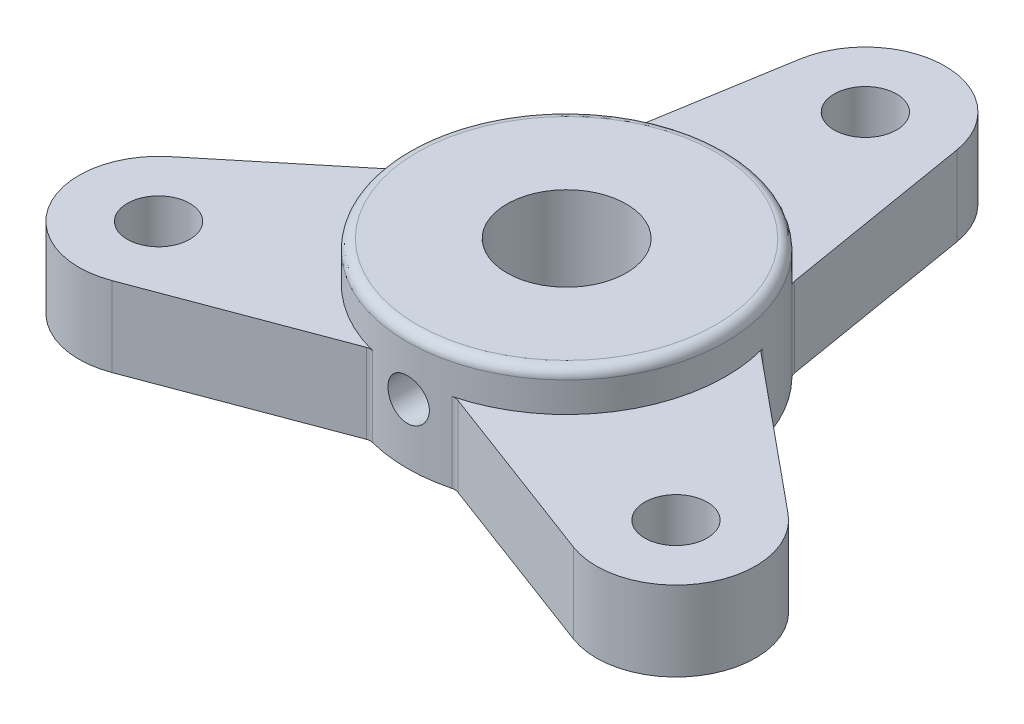
ISO-10303-21;
HEADER;
FILE_DESCRIPTION(('STEP AP214'),'2;1');
FILE_NAME('part.step','',(''),(''),'','','');
FILE_SCHEMA(('AUTOMOTIVE_DESIGN { 1 0 10303 214 1 1 1 1 }'));
ENDSEC;
DATA;
#1=APPLICATION_CONTEXT('core data for automotive mechanical design processes');
#2=APPLICATION_PROTOCOL_DEFINITION('international standard','automotive_design',2000,#1);
#3=PRODUCT_CONTEXT('',#1,'mechanical');
#4=PRODUCT('Part','Part','',(#3));
#5=PRODUCT_RELATED_PRODUCT_CATEGORY('part','',(#4));
#6=PRODUCT_DEFINITION_FORMATION('','',#4);
#7=PRODUCT_DEFINITION_CONTEXT('part definition',#1,'design');
#8=PRODUCT_DEFINITION('design','',#6,#7);
#9=PRODUCT_DEFINITION_SHAPE('','',#8);
#10=(LENGTH_UNIT() NAMED_UNIT(*) SI_UNIT(.MILLI.,.METRE.));
#11=(NAMED_UNIT(*) PLANE_ANGLE_UNIT() SI_UNIT($,.RADIAN.));
#12=(NAMED_UNIT(*) SI_UNIT($,.STERADIAN.) SOLID_ANGLE_UNIT());
#13=UNCERTAINTY_MEASURE_WITH_UNIT(LENGTH_MEASURE(1.E-05),#10,'distance_accuracy_value','');
#14=(GEOMETRIC_REPRESENTATION_CONTEXT(3) GLOBAL_UNCERTAINTY_ASSIGNED_CONTEXT((#13)) GLOBAL_UNIT_ASSIGNED_CONTEXT((#10,
#11,#12)) REPRESENTATION_CONTEXT('',''));
#15=CARTESIAN_POINT('',(0.,0.,0.));
#16=DIRECTION('',(0.,0.,1.));
#17=DIRECTION('',(1.,0.,0.));
#18=AXIS2_PLACEMENT_3D('',#15,#16,#17);
#19=CARTESIAN_POINT('',(0.,0.,0.));
#20=DIRECTION('',(0.,1.,0.));
#21=DIRECTION('',(0.,0.,1.));
#22=AXIS2_PLACEMENT_3D('',#19,#20,#21);
#23=PLANE('',#22);
#24=CARTESIAN_POINT('',(20.6222299276169,0.,11.90625));
#25=DIRECTION('',(0.,1.,0.));
#26=DIRECTION('',(0.,0.,1.));
#27=AXIS2_PLACEMENT_3D('',#24,#25,#26);
#28=CIRCLE('',#27,2.4892);
#29=CARTESIAN_POINT('',(20.6222299276169,0.,14.39545));
#30=VERTEX_POINT('',#29);
#31=EDGE_CURVE('E396',#30,#30,#28,.T.);
#32=ORIENTED_EDGE('',*,*,#31,.F.);
#33=EDGE_LOOP('',(#32));
#34=FACE_BOUND('',#33,.T.);
#35=CARTESIAN_POINT('',(0.,0.,0.));
#36=DIRECTION('',(0.,1.,0.));
#37=DIRECTION('',(0.,0.,1.));
#38=AXIS2_PLACEMENT_3D('',#35,#36,#37);
#39=CIRCLE('',#38,12.7);
#40=CARTESIAN_POINT('',(3.17099498333641,0.,12.2977555194294));
#41=VERTEX_POINT('',#40);
#42=CARTESIAN_POINT('',(12.2356661810243,0.,-3.40271554887235));
#43=VERTEX_POINT('',#42);
#44=EDGE_CURVE('E376',#41,#43,#39,.T.);
#45=ORIENTED_EDGE('',*,*,#44,.F.);
#46=CARTESIAN_POINT('',(3.36918216979494,0.,13.0663652393937));
#47=DIRECTION('',(0.,1.,0.));
#48=DIRECTION('',(0.,0.,1.));
#49=AXIS2_PLACEMENT_3D('',#46,#47,#48);
#50=CIRCLE('',#49,0.79375);
#51=CARTESIAN_POINT('',(3.64786519836011,0.,12.3231460038449));
#52=VERTEX_POINT('',#51);
#53=EDGE_CURVE('E356',#41,#52,#50,.F.);
#54=ORIENTED_EDGE('',*,*,#53,.T.);
#55=DIRECTION('',(-0.936339194392192,0.,-0.351096728900998));
#56=VECTOR('',#55,1.);
#57=CARTESIAN_POINT('',(-3.6015119976426,0.,9.60486545409366));
#58=LINE('',#57,#56);
#59=CARTESIAN_POINT('',(18.3927656990956,0.,17.8520038843904));
#60=VERTEX_POINT('',#59);
#61=EDGE_CURVE('E252',#60,#52,#58,.T.);
#62=ORIENTED_EDGE('',*,*,#61,.F.);
#63=CARTESIAN_POINT('',(20.6222299276169,0.,11.90625));
#64=DIRECTION('',(0.,1.,0.));
#65=DIRECTION('',(0.,0.,1.));
#66=AXIS2_PLACEMENT_3D('',#63,#64,#65);
#67=CIRCLE('',#66,6.35000000000001);
#68=CARTESIAN_POINT('',(24.6566717218884,0.,7.00260039907662));
#69=VERTEX_POINT('',#68);
#70=EDGE_CURVE('E256',#69,#60,#67,.F.);
#71=ORIENTED_EDGE('',*,*,#70,.F.);
#72=DIRECTION('',(-0.772228283609979,0.,-0.635345164452195));
#73=VECTOR('',#72,1.);
#74=CARTESIAN_POINT('',(6.51730148435537,0.,-7.92143360903976));
#75=LINE('',#74,#73);
#76=CARTESIAN_POINT('',(12.4960900930544,0.,-3.00242907056145));
#77=VERTEX_POINT('',#76);
#78=EDGE_CURVE('E259',#69,#77,#75,.T.);
#79=ORIENTED_EDGE('',*,*,#78,.T.);
#80=CARTESIAN_POINT('',(13.0003953173383,0.,-3.61538527067687));
#81=DIRECTION('',(0.,1.,0.));
#82=DIRECTION('',(0.,0.,1.));
#83=AXIS2_PLACEMENT_3D('',#80,#81,#82);
#84=CIRCLE('',#83,0.79375);
#85=EDGE_CURVE('E331',#77,#43,#84,.F.);
#86=ORIENTED_EDGE('',*,*,#85,.T.);
#87=EDGE_LOOP('',(#45,#54,#62,#71,#79,#86));
#88=FACE_BOUND('',#87,.T.);
#89=ADVANCED_FACE('F38',(#34,#88),#23,.T.);
#90=CARTESIAN_POINT('',(0.,0.,-23.8125));
#91=DIRECTION('',(0.,1.,0.));
#92=DIRECTION('',(0.,0.,1.));
#93=AXIS2_PLACEMENT_3D('',#90,#91,#92);
#94=CIRCLE('',#93,2.4892);
#95=CARTESIAN_POINT('',(0.,0.,-21.3233));
#96=VERTEX_POINT('',#95);
#97=EDGE_CURVE('E404',#96,#96,#94,.T.);
#98=ORIENTED_EDGE('',*,*,#97,.F.);
#99=EDGE_LOOP('',(#98));
#100=FACE_BOUND('',#99,.T.);
#101=CARTESIAN_POINT('',(9.06467119768792,0.,-8.89503997055702));
#102=VERTEX_POINT('',#101);
#103=CARTESIAN_POINT('',(-9.06467119768792,0.,-8.89503997055702));
#104=VERTEX_POINT('',#103);
#105=EDGE_CURVE('E287',#102,#104,#39,.T.);
#106=ORIENTED_EDGE('',*,*,#105,.F.);
#107=CARTESIAN_POINT('',(9.63121314754341,0.,-9.45097996871683));
#108=DIRECTION('',(0.,1.,0.));
#109=DIRECTION('',(0.,0.,1.));
#110=AXIS2_PLACEMENT_3D('',#107,#108,#109);
#111=CIRCLE('',#110,0.79375);
#112=CARTESIAN_POINT('',(8.84822489469432,0.,-9.32071693328345));
#113=VERTEX_POINT('',#112);
#114=EDGE_CURVE('E350',#102,#113,#111,.F.);
#115=ORIENTED_EDGE('',*,*,#114,.T.);
#116=DIRECTION('',(0.164110910782213,0.,0.986441893353193));
#117=VECTOR('',#116,1.);
#118=CARTESIAN_POINT('',(10.118813481998,0.,-1.6834318450539));
#119=LINE('',#118,#117);
#120=CARTESIAN_POINT('',(6.26390602279279,0.,-24.8546042834671));
#121=VERTEX_POINT('',#120);
#122=EDGE_CURVE('E189',#121,#113,#119,.T.);
#123=ORIENTED_EDGE('',*,*,#122,.F.);
#124=CARTESIAN_POINT('',(0.,0.,-23.8125));
#125=DIRECTION('',(0.,1.,0.));
#126=DIRECTION('',(0.,0.,1.));
#127=AXIS2_PLACEMENT_3D('',#124,#125,#126);
#128=CIRCLE('',#127,6.35000000000001);
#129=CARTESIAN_POINT('',(-6.26390602279279,0.,-24.8546042834671));
#130=VERTEX_POINT('',#129);
#131=EDGE_CURVE('E235',#130,#121,#128,.F.);
#132=ORIENTED_EDGE('',*,*,#131,.F.);
#133=DIRECTION('',(-0.164110910782213,0.,0.986441893353193));
#134=VECTOR('',#133,1.);
#135=CARTESIAN_POINT('',(-10.118813481998,0.,-1.6834318450539));
#136=LINE('',#135,#134);
#137=CARTESIAN_POINT('',(-8.84822489469432,0.,-9.32071693328345));
#138=VERTEX_POINT('',#137);
#139=EDGE_CURVE('E173',#130,#138,#136,.T.);
#140=ORIENTED_EDGE('',*,*,#139,.T.);
#141=CARTESIAN_POINT('',(-9.63121314754341,0.,-9.45097996871683));
#142=DIRECTION('',(0.,1.,0.));
#143=DIRECTION('',(0.,0.,1.));
#144=AXIS2_PLACEMENT_3D('',#141,#142,#143);
#145=CIRCLE('',#144,0.79375);
#146=EDGE_CURVE('E344',#138,#104,#145,.F.);
#147=ORIENTED_EDGE('',*,*,#146,.T.);
#148=EDGE_LOOP('',(#106,#115,#123,#132,#140,#147));
#149=FACE_BOUND('',#148,.T.);
#150=ADVANCED_FACE('F456',(#100,#149),#23,.T.);
#151=CARTESIAN_POINT('',(0.,-6.35,-23.8125));
#152=DIRECTION('',(0.,1.,0.));
#153=DIRECTION('',(0.,0.,1.));
#154=AXIS2_PLACEMENT_3D('',#151,#152,#153);
#155=CYLINDRICAL_SURFACE('',#154,6.35000000000001);
#156=ORIENTED_EDGE('',*,*,#131,.T.);
#157=DIRECTION('',(0.,1.,0.));
#158=VECTOR('',#157,1.);
#159=CARTESIAN_POINT('',(6.26390602279279,-6.35,-24.8546042834671));
#160=LINE('',#159,#158);
#161=CARTESIAN_POINT('',(6.26390602279279,-6.35,-24.8546042834671));
#162=VERTEX_POINT('',#161);
#163=EDGE_CURVE('E186',#162,#121,#160,.T.);
#164=ORIENTED_EDGE('',*,*,#163,.F.);
#165=CARTESIAN_POINT('',(0.,-6.35,-23.8125));
#166=DIRECTION('',(0.,1.,0.));
#167=DIRECTION('',(0.,0.,1.));
#168=AXIS2_PLACEMENT_3D('',#165,#166,#167);
#169=CIRCLE('',#168,6.35000000000001);
#170=CARTESIAN_POINT('',(-6.26390602279279,-6.35,-24.8546042834671));
#171=VERTEX_POINT('',#170);
#172=EDGE_CURVE('E183',#171,#162,#169,.F.);
#173=ORIENTED_EDGE('',*,*,#172,.F.);
#174=DIRECTION('',(0.,1.,0.));
#175=VECTOR('',#174,1.);
#176=CARTESIAN_POINT('',(-6.26390602279279,-6.35,-24.8546042834671));
#177=LINE('',#176,#175);
#178=EDGE_CURVE('E165',#171,#130,#177,.T.);
#179=ORIENTED_EDGE('',*,*,#178,.T.);
#180=EDGE_LOOP('',(#156,#164,#173,#179));
#181=FACE_BOUND('',#180,.T.);
#182=ADVANCED_FACE('F184',(#181),#155,.T.);
#183=CARTESIAN_POINT('',(10.118813481998,-6.35,-1.6834318450539));
#184=DIRECTION('',(-0.986441893353193,0.,0.164110910782213));
#185=DIRECTION('',(0.164110910782213,0.,0.986441893353193));
#186=AXIS2_PLACEMENT_3D('',#183,#184,#185);
#187=PLANE('',#186);
#188=ORIENTED_EDGE('',*,*,#122,.T.);
#189=DIRECTION('',(0.,1.,0.));
#190=VECTOR('',#189,1.);
#191=CARTESIAN_POINT('',(8.84822489469432,-6.35,-9.32071693328345));
#192=LINE('',#191,#190);
#193=CARTESIAN_POINT('',(8.84822489469432,-6.35,-9.32071693328345));
#194=VERTEX_POINT('',#193);
#195=EDGE_CURVE('E318',#113,#194,#192,.F.);
#196=ORIENTED_EDGE('',*,*,#195,.T.);
#197=DIRECTION('',(0.164110910782213,0.,0.986441893353193));
#198=VECTOR('',#197,1.);
#199=CARTESIAN_POINT('',(10.118813481998,-6.35,-1.6834318450539));
#200=LINE('',#199,#198);
#201=EDGE_CURVE('E209',#162,#194,#200,.T.);
#202=ORIENTED_EDGE('',*,*,#201,.F.);
#203=ORIENTED_EDGE('',*,*,#163,.T.);
#204=EDGE_LOOP('',(#188,#196,#202,#203));
#205=FACE_BOUND('',#204,.T.);
#206=ADVANCED_FACE('F459',(#205),#187,.F.);
#207=CARTESIAN_POINT('',(0.,-6.35,0.));
#208=DIRECTION('',(0.,1.,0.));
#209=DIRECTION('',(0.,0.,1.));
#210=AXIS2_PLACEMENT_3D('',#207,#208,#209);
#211=CYLINDRICAL_SURFACE('',#210,12.7);
#212=CARTESIAN_POINT('',(0.,2.38125,0.));
#213=DIRECTION('',(0.,1.,0.));
#214=DIRECTION('',(0.,0.,1.));
#215=AXIS2_PLACEMENT_3D('',#212,#213,#214);
#216=CIRCLE('',#215,12.7);
#217=CARTESIAN_POINT('',(0.,2.38125,12.7));
#218=VERTEX_POINT('',#217);
#219=EDGE_CURVE('E286',#218,#218,#216,.F.);
#220=ORIENTED_EDGE('',*,*,#219,.T.);
#221=EDGE_LOOP('',(#220));
#222=FACE_BOUND('',#221,.T.);
#223=CARTESIAN_POINT('',(0.,-3.2375,12.7));
#224=CARTESIAN_POINT('',(0.0922643236544293,-3.23749609938659,12.699998671994));
#225=CARTESIAN_POINT('',(0.184585551831701,-3.22973507764408,12.698983958577));
#226=CARTESIAN_POINT('',(0.366656916033323,-3.19889854775735,12.6950336792189));
#227=CARTESIAN_POINT('',(0.456404300819857,-3.17580724584167,12.6920961323539));
#228=CARTESIAN_POINT('',(0.630665930682716,-3.11500377535076,12.6846309677445));
#229=CARTESIAN_POINT('',(0.715183731569128,-3.07730167081513,12.6801044447016));
#230=CARTESIAN_POINT('',(0.876677189933741,-2.98836932502644,12.6699641706627));
#231=CARTESIAN_POINT('',(0.953654092929737,-2.93714132300634,12.6643505996702));
#232=CARTESIAN_POINT('',(1.09835248039503,-2.82228690298132,12.6526253110227));
#233=CARTESIAN_POINT('',(1.16602280747751,-2.75859628136619,12.6465111134287));
#234=CARTESIAN_POINT('',(1.28974639524777,-2.62076249682736,12.6344935666052));
#235=CARTESIAN_POINT('',(1.34579905063923,-2.54661878962182,12.628590228375));
#236=CARTESIAN_POINT('',(1.44488838552916,-2.38964886256161,12.6176384748391));
#237=CARTESIAN_POINT('',(1.48787683376438,-2.30679195375461,12.6125932570568));
#238=CARTESIAN_POINT('',(1.55930941850569,-2.13495819684735,12.6039619389787));
#239=CARTESIAN_POINT('',(1.58775415004511,-2.04598159929354,12.6003757789891));
#240=CARTESIAN_POINT('',(1.62913573830676,-1.86496658016108,12.5950924525977));
#241=CARTESIAN_POINT('',(1.64215921967966,-1.7729482749958,12.5933847384283));
#242=CARTESIAN_POINT('',(1.65259672218689,-1.58801753798053,12.5920194334868));
#243=CARTESIAN_POINT('',(1.65001141980308,-1.49510514505439,12.5923617538666));
#244=CARTESIAN_POINT('',(1.62937579148491,-1.31162886881522,12.595048187675));
#245=CARTESIAN_POINT('',(1.61142107783956,-1.22105402493085,12.5973799247535));
#246=CARTESIAN_POINT('',(1.5607055639362,-1.04421383396314,12.6037631561011));
#247=CARTESIAN_POINT('',(1.52794444173763,-0.957948580629931,12.6078146877641));
#248=CARTESIAN_POINT('',(1.44844392150681,-0.791880416231838,12.6171949708476));
#249=CARTESIAN_POINT('',(1.40166316722615,-0.71209752492623,12.6225274916691));
#250=CARTESIAN_POINT('',(1.29548087678776,-0.561478270450361,12.6338660357438));
#251=CARTESIAN_POINT('',(1.23607871729085,-0.490642349423861,12.6398720922543));
#252=CARTESIAN_POINT('',(1.10581086214983,-0.359372991668148,12.6519359349322));
#253=CARTESIAN_POINT('',(1.03486279102087,-0.299021276587891,12.6579937721697));
#254=CARTESIAN_POINT('',(0.883800168915832,-0.19107044822506,12.6694366630254));
#255=CARTESIAN_POINT('',(0.803685593808557,-0.14347136851542,12.6748217148723));
#256=CARTESIAN_POINT('',(0.636499673099152,-0.0623761601946846,12.6843160147836));
#257=CARTESIAN_POINT('',(0.549425711153016,-0.0288853654700953,12.6884247801714));
#258=CARTESIAN_POINT('',(0.370824682195504,0.0229765938263036,12.6948992577755));
#259=CARTESIAN_POINT('',(0.279297840757892,0.0413485234459673,12.697265058189));
#260=CARTESIAN_POINT('',(0.0950955304063177,0.0623448212905262,12.6999755412598));
#261=CARTESIAN_POINT('',(0.00243309291157124,0.0650817234143081,12.7003346666506));
#262=CARTESIAN_POINT('',(-0.182029172649088,0.0550275688790261,12.6990303893535));
#263=CARTESIAN_POINT('',(-0.2738290205468,0.0422368700996745,12.6973670332797));
#264=CARTESIAN_POINT('',(-0.453626581786281,0.00158410191045401,12.6922136724169));
#265=CARTESIAN_POINT('',(-0.541636678825487,-0.0262240957699221,12.6887301983133));
#266=CARTESIAN_POINT('',(-0.711744460747915,-0.0960663341889979,12.6803264597727));
#267=CARTESIAN_POINT('',(-0.793841930187292,-0.138100892988938,12.6754061430132));
#268=CARTESIAN_POINT('',(-0.950295185231413,-0.235473401542468,12.6646409367626));
#269=CARTESIAN_POINT('',(-1.02460547698562,-0.290883888414733,12.6587910675818));
#270=CARTESIAN_POINT('',(-1.16291160451709,-0.413333033653649,12.6468361529216));
#271=CARTESIAN_POINT('',(-1.22690699643532,-0.480372192154482,12.6407310964754));
#272=CARTESIAN_POINT('',(-1.34316787630944,-0.624672382080719,12.6289090948121));
#273=CARTESIAN_POINT('',(-1.39535861022104,-0.701993888557957,12.6231947745924));
#274=CARTESIAN_POINT('',(-1.48601166201334,-0.864371487200357,12.6128450368234));
#275=CARTESIAN_POINT('',(-1.52447427352191,-0.949427413886836,12.608209596199));
#276=CARTESIAN_POINT('',(-1.58645918066332,-1.12462158179104,12.6005605644568));
#277=CARTESIAN_POINT('',(-1.61002310764713,-1.21474488793017,12.5975424576628));
#278=CARTESIAN_POINT('',(-1.64167555648317,-1.39771107131395,12.5934570424689));
#279=CARTESIAN_POINT('',(-1.64976486095319,-1.49055381078411,12.5923896354139));
#280=CARTESIAN_POINT('',(-1.65022329929213,-1.67557946690477,12.5923295044501));
#281=CARTESIAN_POINT('',(-1.64270988744747,-1.76776210944504,12.5933212793996));
#282=CARTESIAN_POINT('',(-1.61242543776056,-1.94954224659909,12.5972343720598));
#283=CARTESIAN_POINT('',(-1.58965440247591,-2.03913974164622,12.6001556894471));
#284=CARTESIAN_POINT('',(-1.52953872075528,-2.21318762779937,12.6075937988727));
#285=CARTESIAN_POINT('',(-1.49220020555893,-2.29764016707577,12.6121099196059));
#286=CARTESIAN_POINT('',(-1.40402101075824,-2.45910022444814,12.6222298315788));
#287=CARTESIAN_POINT('',(-1.35318010848691,-2.53610761973814,12.6278336407552));
#288=CARTESIAN_POINT('',(-1.23900511908698,-2.68109124123768,12.6395480159047));
#289=CARTESIAN_POINT('',(-1.17558357087424,-2.74899832529012,12.6456619453046));
#290=CARTESIAN_POINT('',(-1.03823082260806,-2.87325029943166,12.6576782655565));
#291=CARTESIAN_POINT('',(-0.964297155552043,-2.92959246783981,12.6635806063442));
#292=CARTESIAN_POINT('',(-0.807668864253321,-3.02931424608186,12.6745356710738));
#293=CARTESIAN_POINT('',(-0.724939541916107,-3.07263972774988,12.6795848100563));
#294=CARTESIAN_POINT('',(-0.553358526270595,-3.14472022442944,12.6882285390702));
#295=CARTESIAN_POINT('',(-0.464513546845601,-3.17349093701956,12.6918246953228));
#296=CARTESIAN_POINT('',(-0.31268296585672,-3.20882360339538,12.6962987165773));
#297=CARTESIAN_POINT('',(-0.250651402771433,-3.21956162116512,12.6976798697008));
#298=CARTESIAN_POINT('',(-0.125755368432594,-3.23390111960123,12.6995309602848));
#299=CARTESIAN_POINT('',(-0.0628909040155511,-3.2375026588078,12.7000009052199));
#300=CARTESIAN_POINT('',(0.,-3.2375,12.7));
#301=B_SPLINE_CURVE_WITH_KNOTS('',3,(#223,#224,#225,#226,#227,#228,#229,#230,#231,#232,#233,
#234,#235,#236,#237,#238,#239,#240,#241,#242,#243,#244,#245,#246,#247,#248,#249,#250,#251,#252,
#253,#254,#255,#256,#257,#258,#259,#260,#261,#262,#263,#264,#265,#266,#267,#268,#269,#270,#271,
#272,#273,#274,#275,#276,#277,#278,#279,#280,#281,#282,#283,#284,#285,#286,#287,#288,#289,#290,
#291,#292,#293,#294,#295,#296,#297,#298,#299,#300),.UNSPECIFIED.,.T.,.F.,(4,2,2,2,2,2,2,2,2,2,2,
2,2,2,2,2,2,2,2,2,2,2,2,2,2,2,2,2,2,2,2,2,2,2,2,2,2,2,4),(0.,0.276563234458574,
0.553411836748436,0.830070081448883,1.10668255364166,1.38475946205798,1.66285085501546,
1.94195678834348,2.22105130157667,2.49857052626907,2.77607772341462,3.05187100580363,
3.32767028514399,3.60429128462149,3.88092594888514,4.1596285798139,4.43833194445555,
4.71714058346982,4.99593511328556,5.27272045235992,5.54949941221463,5.82529202502766,
6.1010946820704,6.37842800235831,6.65577325335369,6.93482849066393,7.2138777589639,
7.492143793944,7.77039575544938,8.04656068399887,8.32272556625542,8.59877433991892,
8.87482766616747,9.15287199745467,9.43098168870934,9.71023234573236,9.98918118039048,
10.1776988416266,10.3662149564546),.UNSPECIFIED.);
#302=CARTESIAN_POINT('',(0.,-3.2375,12.7));
#303=VERTEX_POINT('',#302);
#304=EDGE_CURVE('E408',#303,#303,#301,.T.);
#305=ORIENTED_EDGE('',*,*,#304,.F.);
#306=EDGE_LOOP('',(#305));
#307=FACE_BOUND('',#306,.T.);
#308=ORIENTED_EDGE('',*,*,#44,.T.);
#309=DIRECTION('',(0.,1.,0.));
#310=VECTOR('',#309,1.);
#311=CARTESIAN_POINT('',(12.2356661810243,-6.35,-3.40271554887235));
#312=LINE('',#311,#310);
#313=CARTESIAN_POINT('',(12.2356661810243,-6.35,-3.40271554887235));
#314=VERTEX_POINT('',#313);
#315=EDGE_CURVE('E309',#43,#314,#312,.F.);
#316=ORIENTED_EDGE('',*,*,#315,.T.);
#317=CARTESIAN_POINT('',(0.,-6.35,0.));
#318=DIRECTION('',(0.,1.,0.));
#319=DIRECTION('',(0.,0.,1.));
#320=AXIS2_PLACEMENT_3D('',#317,#318,#319);
#321=CIRCLE('',#320,12.7);
#322=CARTESIAN_POINT('',(9.06467119768792,-6.35,-8.89503997055702));
#323=VERTEX_POINT('',#322);
#324=EDGE_CURVE('E203',#314,#323,#321,.T.);
#325=ORIENTED_EDGE('',*,*,#324,.T.);
#326=DIRECTION('',(0.,1.,0.));
#327=VECTOR('',#326,1.);
#328=CARTESIAN_POINT('',(9.06467119768792,-6.35,-8.89503997055702));
#329=LINE('',#328,#327);
#330=EDGE_CURVE('E298',#323,#102,#329,.T.);
#331=ORIENTED_EDGE('',*,*,#330,.T.);
#332=ORIENTED_EDGE('',*,*,#105,.T.);
#333=DIRECTION('',(0.,1.,0.));
#334=VECTOR('',#333,1.);
#335=CARTESIAN_POINT('',(-9.06467119768792,-6.35,-8.89503997055702));
#336=LINE('',#335,#334);
#337=CARTESIAN_POINT('',(-9.06467119768792,-6.35,-8.89503997055702));
#338=VERTEX_POINT('',#337);
#339=EDGE_CURVE('E302',#104,#338,#336,.F.);
#340=ORIENTED_EDGE('',*,*,#339,.T.);
#341=CARTESIAN_POINT('',(-12.2356661810243,-6.35,-3.40271554887234));
#342=VERTEX_POINT('',#341);
#343=EDGE_CURVE('E197',#338,#342,#321,.T.);
#344=ORIENTED_EDGE('',*,*,#343,.T.);
#345=DIRECTION('',(0.,1.,0.));
#346=VECTOR('',#345,1.);
#347=CARTESIAN_POINT('',(-12.2356661810243,-6.35,-3.40271554887234));
#348=LINE('',#347,#346);
#349=CARTESIAN_POINT('',(-12.2356661810243,0.,-3.40271554887234));
#350=VERTEX_POINT('',#349);
#351=EDGE_CURVE('E305',#342,#350,#348,.T.);
#352=ORIENTED_EDGE('',*,*,#351,.T.);
#353=CARTESIAN_POINT('',(-3.17099498333641,0.,12.2977555194294));
#354=VERTEX_POINT('',#353);
#355=EDGE_CURVE('E268',#350,#354,#39,.T.);
#356=ORIENTED_EDGE('',*,*,#355,.T.);
#357=DIRECTION('',(0.,1.,0.));
#358=VECTOR('',#357,1.);
#359=CARTESIAN_POINT('',(-3.17099498333641,-6.35,12.2977555194294));
#360=LINE('',#359,#358);
#361=CARTESIAN_POINT('',(-3.17099498333641,-6.35,12.2977555194294));
#362=VERTEX_POINT('',#361);
#363=EDGE_CURVE('E291',#354,#362,#360,.F.);
#364=ORIENTED_EDGE('',*,*,#363,.T.);
#365=CARTESIAN_POINT('',(3.17099498333641,-6.35,12.2977555194294));
#366=VERTEX_POINT('',#365);
#367=EDGE_CURVE('E204',#362,#366,#321,.T.);
#368=ORIENTED_EDGE('',*,*,#367,.T.);
#369=DIRECTION('',(0.,1.,0.));
#370=VECTOR('',#369,1.);
#371=CARTESIAN_POINT('',(3.17099498333641,-6.35,12.2977555194294));
#372=LINE('',#371,#370);
#373=EDGE_CURVE('E294',#366,#41,#372,.T.);
#374=ORIENTED_EDGE('',*,*,#373,.T.);
#375=EDGE_LOOP('',(#308,#316,#325,#331,#332,#340,#344,#352,#356,#364,#368,#374));
#376=FACE_BOUND('',#375,.T.);
#377=ADVANCED_FACE('F370',(#222,#307,#376),#211,.T.);
#378=CARTESIAN_POINT('',(6.51730148435537,-6.35,-7.92143360903976));
#379=DIRECTION('',(0.635345164452195,0.,-0.772228283609979));
#380=DIRECTION('',(-0.772228283609979,0.,-0.635345164452195));
#381=AXIS2_PLACEMENT_3D('',#378,#379,#380);
#382=PLANE('',#381);
#383=DIRECTION('',(-0.772228283609979,0.,-0.635345164452195));
#384=VECTOR('',#383,1.);
#385=CARTESIAN_POINT('',(6.51730148435537,-6.35,-7.92143360903976));
#386=LINE('',#385,#384);
#387=CARTESIAN_POINT('',(24.6566717218884,-6.35,7.00260039907662));
#388=VERTEX_POINT('',#387);
#389=CARTESIAN_POINT('',(12.4960900930544,-6.35,-3.00242907056145));
#390=VERTEX_POINT('',#389);
#391=EDGE_CURVE('E210',#388,#390,#386,.T.);
#392=ORIENTED_EDGE('',*,*,#391,.T.);
#393=DIRECTION('',(0.,-1.,0.));
#394=VECTOR('',#393,1.);
#395=CARTESIAN_POINT('',(12.4960900930544,0.,-3.00242907056145));
#396=LINE('',#395,#394);
#397=EDGE_CURVE('E282',#390,#77,#396,.F.);
#398=ORIENTED_EDGE('',*,*,#397,.T.);
#399=ORIENTED_EDGE('',*,*,#78,.F.);
#400=DIRECTION('',(0.,1.,0.));
#401=VECTOR('',#400,1.);
#402=CARTESIAN_POINT('',(24.6566717218884,-6.35,7.00260039907662));
#403=LINE('',#402,#401);
#404=EDGE_CURVE('E269',#388,#69,#403,.T.);
#405=ORIENTED_EDGE('',*,*,#404,.F.);
#406=EDGE_LOOP('',(#392,#398,#399,#405));
#407=FACE_BOUND('',#406,.T.);
#408=ADVANCED_FACE('F466',(#407),#382,.T.);
#409=CARTESIAN_POINT('',(20.6222299276169,-6.35,11.90625));
#410=DIRECTION('',(0.,1.,0.));
#411=DIRECTION('',(0.,0.,1.));
#412=AXIS2_PLACEMENT_3D('',#409,#410,#411);
#413=CYLINDRICAL_SURFACE('',#412,6.35000000000001);
#414=ORIENTED_EDGE('',*,*,#70,.T.);
#415=DIRECTION('',(0.,1.,0.));
#416=VECTOR('',#415,1.);
#417=CARTESIAN_POINT('',(18.3927656990956,-6.35,17.8520038843904));
#418=LINE('',#417,#416);
#419=CARTESIAN_POINT('',(18.3927656990956,-6.35,17.8520038843904));
#420=VERTEX_POINT('',#419);
#421=EDGE_CURVE('E272',#420,#60,#418,.T.);
#422=ORIENTED_EDGE('',*,*,#421,.F.);
#423=CARTESIAN_POINT('',(20.6222299276169,-6.35,11.90625));
#424=DIRECTION('',(0.,1.,0.));
#425=DIRECTION('',(0.,0.,1.));
#426=AXIS2_PLACEMENT_3D('',#423,#424,#425);
#427=CIRCLE('',#426,6.35000000000001);
#428=EDGE_CURVE('E224',#388,#420,#427,.F.);
#429=ORIENTED_EDGE('',*,*,#428,.F.);
#430=ORIENTED_EDGE('',*,*,#404,.T.);
#431=EDGE_LOOP('',(#414,#422,#429,#430));
#432=FACE_BOUND('',#431,.T.);
#433=ADVANCED_FACE('F491',(#432),#413,.T.);
#434=CARTESIAN_POINT('',(-3.6015119976426,-6.35,9.60486545409366));
#435=DIRECTION('',(0.351096728900998,0.,-0.936339194392192));
#436=DIRECTION('',(-0.936339194392192,0.,-0.351096728900998));
#437=AXIS2_PLACEMENT_3D('',#434,#435,#436);
#438=PLANE('',#437);
#439=ORIENTED_EDGE('',*,*,#61,.T.);
#440=DIRECTION('',(0.,1.,0.));
#441=VECTOR('',#440,1.);
#442=CARTESIAN_POINT('',(3.6478651983601,-6.35,12.3231460038449));
#443=LINE('',#442,#441);
#444=CARTESIAN_POINT('',(3.64786519836011,-6.35,12.3231460038449));
#445=VERTEX_POINT('',#444);
#446=EDGE_CURVE('E321',#52,#445,#443,.F.);
#447=ORIENTED_EDGE('',*,*,#446,.T.);
#448=DIRECTION('',(-0.936339194392192,0.,-0.351096728900998));
#449=VECTOR('',#448,1.);
#450=CARTESIAN_POINT('',(-3.6015119976426,-6.35,9.60486545409366));
#451=LINE('',#450,#449);
#452=EDGE_CURVE('E220',#420,#445,#451,.T.);
#453=ORIENTED_EDGE('',*,*,#452,.F.);
#454=ORIENTED_EDGE('',*,*,#421,.T.);
#455=EDGE_LOOP('',(#439,#447,#453,#454));
#456=FACE_BOUND('',#455,.T.);
#457=ADVANCED_FACE('F486',(#456),#438,.F.);
#458=CARTESIAN_POINT('',(3.6015119976426,-6.35,9.60486545409365));
#459=DIRECTION('',(0.351096728900999,0.,0.936339194392192));
#460=DIRECTION('',(0.936339194392192,0.,-0.351096728900999));
#461=AXIS2_PLACEMENT_3D('',#458,#459,#460);
#462=PLANE('',#461);
#463=DIRECTION('',(0.936339194392192,0.,-0.351096728900999));
#464=VECTOR('',#463,1.);
#465=CARTESIAN_POINT('',(3.6015119976426,-6.35,9.60486545409365));
#466=LINE('',#465,#464);
#467=CARTESIAN_POINT('',(-18.3927656990956,-6.35,17.8520038843904));
#468=VERTEX_POINT('',#467);
#469=CARTESIAN_POINT('',(-3.6478651983601,-6.35,12.3231460038449));
#470=VERTEX_POINT('',#469);
#471=EDGE_CURVE('E217',#468,#470,#466,.T.);
#472=ORIENTED_EDGE('',*,*,#471,.T.);
#473=DIRECTION('',(0.,-1.,0.));
#474=VECTOR('',#473,1.);
#475=CARTESIAN_POINT('',(-3.6478651983601,0.,12.3231460038449));
#476=LINE('',#475,#474);
#477=CARTESIAN_POINT('',(-3.6478651983601,0.,12.3231460038449));
#478=VERTEX_POINT('',#477);
#479=EDGE_CURVE('E324',#470,#478,#476,.F.);
#480=ORIENTED_EDGE('',*,*,#479,.T.);
#481=DIRECTION('',(0.936339194392192,0.,-0.351096728900999));
#482=VECTOR('',#481,1.);
#483=CARTESIAN_POINT('',(3.6015119976426,0.,9.60486545409365));
#484=LINE('',#483,#482);
#485=CARTESIAN_POINT('',(-18.3927656990956,0.,17.8520038843904));
#486=VERTEX_POINT('',#485);
#487=EDGE_CURVE('E248',#486,#478,#484,.T.);
#488=ORIENTED_EDGE('',*,*,#487,.F.);
#489=DIRECTION('',(0.,1.,0.));
#490=VECTOR('',#489,1.);
#491=CARTESIAN_POINT('',(-18.3927656990956,-6.35,17.8520038843904));
#492=LINE('',#491,#490);
#493=EDGE_CURVE('E276',#468,#486,#492,.T.);
#494=ORIENTED_EDGE('',*,*,#493,.F.);
#495=EDGE_LOOP('',(#472,#480,#488,#494));
#496=FACE_BOUND('',#495,.T.);
#497=ADVANCED_FACE('F523',(#496),#462,.T.);
#498=CARTESIAN_POINT('',(-20.6222299276169,-6.35,11.90625));
#499=DIRECTION('',(0.,1.,0.));
#500=DIRECTION('',(0.,0.,1.));
#501=AXIS2_PLACEMENT_3D('',#498,#499,#500);
#502=CYLINDRICAL_SURFACE('',#501,6.35000000000001);
#503=CARTESIAN_POINT('',(-20.6222299276169,0.,11.90625));
#504=DIRECTION('',(0.,1.,0.));
#505=DIRECTION('',(0.,0.,1.));
#506=AXIS2_PLACEMENT_3D('',#503,#504,#505);
#507=CIRCLE('',#506,6.35000000000001);
#508=CARTESIAN_POINT('',(-24.6566717218884,0.,7.00260039907665));
#509=VERTEX_POINT('',#508);
#510=EDGE_CURVE('E245',#486,#509,#507,.F.);
#511=ORIENTED_EDGE('',*,*,#510,.T.);
#512=DIRECTION('',(0.,1.,0.));
#513=VECTOR('',#512,1.);
#514=CARTESIAN_POINT('',(-24.6566717218884,-6.35,7.00260039907665));
#515=LINE('',#514,#513);
#516=CARTESIAN_POINT('',(-24.6566717218884,-6.35,7.00260039907665));
#517=VERTEX_POINT('',#516);
#518=EDGE_CURVE('E178',#517,#509,#515,.T.);
#519=ORIENTED_EDGE('',*,*,#518,.F.);
#520=CARTESIAN_POINT('',(-20.6222299276169,-6.35,11.90625));
#521=DIRECTION('',(0.,1.,0.));
#522=DIRECTION('',(0.,0.,1.));
#523=AXIS2_PLACEMENT_3D('',#520,#521,#522);
#524=CIRCLE('',#523,6.35000000000001);
#525=EDGE_CURVE('E214',#468,#517,#524,.F.);
#526=ORIENTED_EDGE('',*,*,#525,.F.);
#527=ORIENTED_EDGE('',*,*,#493,.T.);
#528=EDGE_LOOP('',(#511,#519,#526,#527));
#529=FACE_BOUND('',#528,.T.);
#530=ADVANCED_FACE('F521',(#529),#502,.T.);
#531=CARTESIAN_POINT('',(-6.51730148435538,-6.35,-7.92143360903976));
#532=DIRECTION('',(0.635345164452196,0.,0.772228283609978));
#533=DIRECTION('',(0.772228283609978,0.,-0.635345164452196));
#534=AXIS2_PLACEMENT_3D('',#531,#532,#533);
#535=PLANE('',#534);
#536=DIRECTION('',(0.772228283609978,0.,-0.635345164452196));
#537=VECTOR('',#536,1.);
#538=CARTESIAN_POINT('',(-6.51730148435538,0.,-7.92143360903976));
#539=LINE('',#538,#537);
#540=CARTESIAN_POINT('',(-12.4960900930544,0.,-3.00242907056144));
#541=VERTEX_POINT('',#540);
#542=EDGE_CURVE('E241',#509,#541,#539,.T.);
#543=ORIENTED_EDGE('',*,*,#542,.T.);
#544=DIRECTION('',(0.,1.,0.));
#545=VECTOR('',#544,1.);
#546=CARTESIAN_POINT('',(-12.4960900930544,-6.35,-3.00242907056144));
#547=LINE('',#546,#545);
#548=CARTESIAN_POINT('',(-12.4960900930544,-6.35,-3.00242907056144));
#549=VERTEX_POINT('',#548);
#550=EDGE_CURVE('E312',#541,#549,#547,.F.);
#551=ORIENTED_EDGE('',*,*,#550,.T.);
#552=DIRECTION('',(0.772228283609978,0.,-0.635345164452196));
#553=VECTOR('',#552,1.);
#554=CARTESIAN_POINT('',(-6.51730148435538,-6.35,-7.92143360903976));
#555=LINE('',#554,#553);
#556=EDGE_CURVE('E201',#517,#549,#555,.T.);
#557=ORIENTED_EDGE('',*,*,#556,.F.);
#558=ORIENTED_EDGE('',*,*,#518,.T.);
#559=EDGE_LOOP('',(#543,#551,#557,#558));
#560=FACE_BOUND('',#559,.T.);
#561=ADVANCED_FACE('F517',(#560),#535,.F.);
#562=CARTESIAN_POINT('',(-10.118813481998,-6.35,-1.6834318450539));
#563=DIRECTION('',(-0.986441893353193,0.,-0.164110910782213));
#564=DIRECTION('',(-0.164110910782213,0.,0.986441893353193));
#565=AXIS2_PLACEMENT_3D('',#562,#563,#564);
#566=PLANE('',#565);
#567=DIRECTION('',(-0.164110910782213,0.,0.986441893353193));
#568=VECTOR('',#567,1.);
#569=CARTESIAN_POINT('',(-10.118813481998,-6.35,-1.6834318450539));
#570=LINE('',#569,#568);
#571=CARTESIAN_POINT('',(-8.84822489469432,-6.35,-9.32071693328345));
#572=VERTEX_POINT('',#571);
#573=EDGE_CURVE('E170',#171,#572,#570,.T.);
#574=ORIENTED_EDGE('',*,*,#573,.T.);
#575=DIRECTION('',(0.,-1.,0.));
#576=VECTOR('',#575,1.);
#577=CARTESIAN_POINT('',(-8.84822489469432,0.,-9.32071693328345));
#578=LINE('',#577,#576);
#579=EDGE_CURVE('E315',#572,#138,#578,.F.);
#580=ORIENTED_EDGE('',*,*,#579,.T.);
#581=ORIENTED_EDGE('',*,*,#139,.F.);
#582=ORIENTED_EDGE('',*,*,#178,.F.);
#583=EDGE_LOOP('',(#574,#580,#581,#582));
#584=FACE_BOUND('',#583,.T.);
#585=ADVANCED_FACE('F167',(#584),#566,.T.);
#586=CARTESIAN_POINT('',(0.,-6.35,0.));
#587=DIRECTION('',(0.,1.,0.));
#588=DIRECTION('',(0.,0.,1.));
#589=AXIS2_PLACEMENT_3D('',#586,#587,#588);
#590=CYLINDRICAL_SURFACE('',#589,4.7625);
#591=CARTESIAN_POINT('',(0.,-3.2375,4.7625));
#592=CARTESIAN_POINT('',(0.0898253949188852,-3.23750117271477,4.76250081041561));
#593=CARTESIAN_POINT('',(0.179642451132032,-3.23014129438701,4.75993566191154));
#594=CARTESIAN_POINT('',(0.35661891731184,-3.20099502720785,4.74995649023625));
#595=CARTESIAN_POINT('',(0.443778259126049,-3.17920826872915,4.74254234283017));
#596=CARTESIAN_POINT('',(0.612862388585804,-3.12205316520973,4.72366785633018));
#597=CARTESIAN_POINT('',(0.694796052233337,-3.08670860606739,4.71221460628725));
#598=CARTESIAN_POINT('',(0.851570909755169,-3.00355282661959,4.68642222164995));
#599=CARTESIAN_POINT('',(0.92641053060601,-2.95573885013832,4.67208244919358));
#600=CARTESIAN_POINT('',(1.0696462156424,-2.847143604065,4.64142325860991));
#601=CARTESIAN_POINT('',(1.13774350310249,-2.78598250317606,4.62505371060088));
#602=CARTESIAN_POINT('',(1.26294676862535,-2.65323617455888,4.59244655917909));
#603=CARTESIAN_POINT('',(1.32005005852594,-2.58164840488394,4.57620898896369));
#604=CARTESIAN_POINT('',(1.42340773548549,-2.42732198511277,4.54514330229731));
#605=CARTESIAN_POINT('',(1.46926360833448,-2.34430306329461,4.53037571440101));
#606=CARTESIAN_POINT('',(1.5462328308543,-2.17113762179726,4.50468965500239));
#607=CARTESIAN_POINT('',(1.57735109468741,-2.08099348969005,4.49376990077564));
#608=CARTESIAN_POINT('',(1.62282290621445,-1.89954869222693,4.47754615124934));
#609=CARTESIAN_POINT('',(1.63773970315193,-1.80840651452175,4.47205412442554));
#610=CARTESIAN_POINT('',(1.65214631012102,-1.62476014458798,4.46675312351164));
#611=CARTESIAN_POINT('',(1.65164134981625,-1.53225642470694,4.46694222289759));
#612=CARTESIAN_POINT('',(1.63565404552168,-1.3534177249926,4.47281812706528));
#613=CARTESIAN_POINT('',(1.62092011445564,-1.26700521623478,4.47823020473562));
#614=CARTESIAN_POINT('',(1.57811897370613,-1.09796459105469,4.49349058508904));
#615=CARTESIAN_POINT('',(1.55005004661618,-1.01533696358839,4.50333945917612));
#616=CARTESIAN_POINT('',(1.48091040994439,-0.854564963210196,4.52655000996095));
#617=CARTESIAN_POINT('',(1.43962650157543,-0.776520854799491,4.53996863194386));
#618=CARTESIAN_POINT('',(1.34537689428469,-0.628237328926835,4.56878436077196));
#619=CARTESIAN_POINT('',(1.29240760907409,-0.558000317467754,4.58418207440145));
#620=CARTESIAN_POINT('',(1.17274813536149,-0.423137426734176,4.61628763819478));
#621=CARTESIAN_POINT('',(1.10545031441619,-0.359055410801894,4.63302027410213));
#622=CARTESIAN_POINT('',(0.960860548808902,-0.242938678474564,4.6651507511633));
#623=CARTESIAN_POINT('',(0.883567486867128,-0.190905310708858,4.68054844277358));
#624=CARTESIAN_POINT('',(0.719957465690705,-0.0998775047879534,4.70850547104116));
#625=CARTESIAN_POINT('',(0.633547180840691,-0.0610394495902943,4.72103023032095));
#626=CARTESIAN_POINT('',(0.454880375427903,0.00137658397174743,4.74157778590567));
#627=CARTESIAN_POINT('',(0.362626070516801,0.0249603081630366,4.74960227716846));
#628=CARTESIAN_POINT('',(0.179486080180907,0.0552099903215299,4.75995912800617));
#629=CARTESIAN_POINT('',(0.088735453320036,0.0626100404310145,4.7625382866501));
#630=CARTESIAN_POINT('',(-0.092735611166243,0.0623875353252625,4.76246087348465));
#631=CARTESIAN_POINT('',(-0.183456051272957,0.0547677489361317,4.75980526667613));
#632=CARTESIAN_POINT('',(-0.359282707540807,0.0252963983981529,4.7497198032301));
#633=CARTESIAN_POINT('',(-0.444475721518183,0.00390456574159977,4.7424442703079));
#634=CARTESIAN_POINT('',(-0.610021947958721,-0.0519196495825637,4.72400488803494));
#635=CARTESIAN_POINT('',(-0.690374534078809,-0.0863537157096363,4.71284053674));
#636=CARTESIAN_POINT('',(-0.846416684350204,-0.168324640563928,4.6873670457624));
#637=CARTESIAN_POINT('',(-0.921918179256249,-0.216194635555698,4.67298012707027));
#638=CARTESIAN_POINT('',(-1.0640500706656,-0.323292110138706,4.64268169141203));
#639=CARTESIAN_POINT('',(-1.13067755901652,-0.382523297530944,4.62676967757148));
#640=CARTESIAN_POINT('',(-1.25659227997991,-0.514108499557602,4.59421605823554));
#641=CARTESIAN_POINT('',(-1.31535606686557,-0.586965316906398,4.57757713576575));
#642=CARTESIAN_POINT('',(-1.41990000732923,-0.741856412039354,4.5462378124464));
#643=CARTESIAN_POINT('',(-1.46567978704731,-0.823890953990979,4.53153746742252));
#644=CARTESIAN_POINT('',(-1.54280793576859,-0.995011104324027,4.50586407355567));
#645=CARTESIAN_POINT('',(-1.57416294263032,-1.0840934473511,4.49488931091928));
#646=CARTESIAN_POINT('',(-1.62126545969153,-1.26674799071911,4.47811811764898));
#647=CARTESIAN_POINT('',(-1.63702076252468,-1.36031792482381,4.47231910167954));
#648=CARTESIAN_POINT('',(-1.65183985201511,-1.54371548704818,4.46686550238245));
#649=CARTESIAN_POINT('',(-1.65177948098012,-1.63346348472713,4.46688850412592));
#650=CARTESIAN_POINT('',(-1.63715147880288,-1.8115978823149,4.47227018906053));
#651=CARTESIAN_POINT('',(-1.62258484942189,-1.89998437581736,4.47762850381001));
#652=CARTESIAN_POINT('',(-1.57999808755729,-2.07092152576496,4.49282790698938));
#653=CARTESIAN_POINT('',(-1.55228368000422,-2.15355816086738,4.50256687784833));
#654=CARTESIAN_POINT('',(-1.48444161808838,-2.31306851349556,4.52538551820088));
#655=CARTESIAN_POINT('',(-1.44431107640365,-2.38994088539398,4.53846596461769));
#656=CARTESIAN_POINT('',(-1.35060377444887,-2.53961519901291,4.56725093634774));
#657=CARTESIAN_POINT('',(-1.29648892561867,-2.61206209677221,4.58304914185118));
#658=CARTESIAN_POINT('',(-1.17723495452151,-2.74712886720671,4.6151199782534));
#659=CARTESIAN_POINT('',(-1.11209259822776,-2.8097458466582,4.6313927471648));
#660=CARTESIAN_POINT('',(-0.969244568931801,-2.9261232525682,4.66342674657908));
#661=CARTESIAN_POINT('',(-0.891116532920201,-2.9793817451591,4.67913517718381));
#662=CARTESIAN_POINT('',(-0.726486895789184,-3.07196300971632,4.70750341989));
#663=CARTESIAN_POINT('',(-0.63998663473056,-3.11128800720107,4.7201637187487));
#664=CARTESIAN_POINT('',(-0.462648536873139,-3.17404939528772,4.74079942473834));
#665=CARTESIAN_POINT('',(-0.371918222078164,-3.19776178916801,4.74885586141626));
#666=CARTESIAN_POINT('',(-0.187454901841981,-3.22948385233806,4.75970484550713));
#667=CARTESIAN_POINT('',(-0.09372291190274,-3.23749877640122,4.76249915442052));
#668=CARTESIAN_POINT('',(0.,-3.2375,4.7625));
#669=B_SPLINE_CURVE_WITH_KNOTS('',3,(#591,#592,#593,#594,#595,#596,#597,#598,#599,#600,#601,
#602,#603,#604,#605,#606,#607,#608,#609,#610,#611,#612,#613,#614,#615,#616,#617,#618,#619,#620,
#621,#622,#623,#624,#625,#626,#627,#628,#629,#630,#631,#632,#633,#634,#635,#636,#637,#638,#639,
#640,#641,#642,#643,#644,#645,#646,#647,#648,#649,#650,#651,#652,#653,#654,#655,#656,#657,#658,
#659,#660,#661,#662,#663,#664,#665,#666,#667,#668),.UNSPECIFIED.,.T.,.F.,(4,2,2,2,2,2,2,2,2,2,2,
2,2,2,2,2,2,2,2,2,2,2,2,2,2,2,2,2,2,2,2,2,2,2,2,2,2,2,4),(0.,0.26913103518841,0.538268965979092,
0.80693686309677,1.07566419559003,1.35336875512373,1.63114113070374,1.91766550938377,
2.20409428094358,2.48021065567753,2.75623339777922,3.0184865701972,3.28077352721029,
3.5475254675644,3.81435938932905,4.09632098382386,4.37831412360555,4.66354134583453,
4.94866106927495,5.22055351000007,5.49239583350297,5.75560362886004,6.01884541001733,
6.2892993462918,6.5598416976555,6.84371466106413,7.12759579744669,7.4113461690428,
7.69495472513035,7.96286108516903,8.23074894563348,8.49269201073185,8.75469603547675,
9.02887277495052,9.30313006172314,9.58928275701986,9.87538972613775,10.156292385325,
10.4371009954517),.UNSPECIFIED.);
#670=CARTESIAN_POINT('',(0.,-3.2375,4.7625));
#671=VERTEX_POINT('',#670);
#672=EDGE_CURVE('E417',#671,#671,#669,.T.);
#673=ORIENTED_EDGE('',*,*,#672,.T.);
#674=EDGE_LOOP('',(#673));
#675=FACE_BOUND('',#674,.T.);
#676=CARTESIAN_POINT('',(0.,-6.35,0.));
#677=DIRECTION('',(0.,1.,0.));
#678=DIRECTION('',(0.,0.,1.));
#679=AXIS2_PLACEMENT_3D('',#676,#677,#678);
#680=CIRCLE('',#679,4.7625);
#681=CARTESIAN_POINT('',(0.,-6.35,4.7625));
#682=VERTEX_POINT('',#681);
#683=EDGE_CURVE('E179',#682,#682,#680,.T.);
#684=ORIENTED_EDGE('',*,*,#683,.F.);
#685=EDGE_LOOP('',(#684));
#686=FACE_BOUND('',#685,.T.);
#687=CARTESIAN_POINT('',(0.,3.175,0.));
#688=DIRECTION('',(0.,1.,0.));
#689=DIRECTION('',(0.,0.,1.));
#690=AXIS2_PLACEMENT_3D('',#687,#688,#689);
#691=CIRCLE('',#690,4.7625);
#692=CARTESIAN_POINT('',(0.,3.175,4.7625));
#693=VERTEX_POINT('',#692);
#694=EDGE_CURVE('E238',#693,#693,#691,.T.);
#695=ORIENTED_EDGE('',*,*,#694,.T.);
#696=EDGE_LOOP('',(#695));
#697=FACE_BOUND('',#696,.T.);
#698=ADVANCED_FACE('F451',(#675,#686,#697),#590,.F.);
#699=CARTESIAN_POINT('',(0.,-6.35,0.));
#700=DIRECTION('',(0.,1.,0.));
#701=DIRECTION('',(0.,0.,1.));
#702=AXIS2_PLACEMENT_3D('',#699,#700,#701);
#703=PLANE('',#702);
#704=CARTESIAN_POINT('',(0.,-6.35,-23.8125));
#705=DIRECTION('',(0.,1.,0.));
#706=DIRECTION('',(0.,0.,1.));
#707=AXIS2_PLACEMENT_3D('',#704,#705,#706);
#708=CIRCLE('',#707,2.4892);
#709=CARTESIAN_POINT('',(0.,-6.35,-21.3233));
#710=VERTEX_POINT('',#709);
#711=EDGE_CURVE('E400',#710,#710,#708,.T.);
#712=ORIENTED_EDGE('',*,*,#711,.T.);
#713=EDGE_LOOP('',(#712));
#714=FACE_BOUND('',#713,.T.);
#715=CARTESIAN_POINT('',(20.6222299276169,-6.35,11.90625));
#716=DIRECTION('',(0.,1.,0.));
#717=DIRECTION('',(0.,0.,1.));
#718=AXIS2_PLACEMENT_3D('',#715,#716,#717);
#719=CIRCLE('',#718,2.4892);
#720=CARTESIAN_POINT('',(20.6222299276169,-6.35,14.39545));
#721=VERTEX_POINT('',#720);
#722=EDGE_CURVE('E390',#721,#721,#719,.T.);
#723=ORIENTED_EDGE('',*,*,#722,.T.);
#724=EDGE_LOOP('',(#723));
#725=FACE_BOUND('',#724,.T.);
#726=CARTESIAN_POINT('',(-20.6222299276169,-6.35,11.90625));
#727=DIRECTION('',(0.,1.,0.));
#728=DIRECTION('',(0.,0.,1.));
#729=AXIS2_PLACEMENT_3D('',#726,#727,#728);
#730=CIRCLE('',#729,2.4892);
#731=CARTESIAN_POINT('',(-20.6222299276169,-6.35,14.39545));
#732=VERTEX_POINT('',#731);
#733=EDGE_CURVE('E379',#732,#732,#730,.T.);
#734=ORIENTED_EDGE('',*,*,#733,.T.);
#735=EDGE_LOOP('',(#734));
#736=FACE_BOUND('',#735,.T.);
#737=ORIENTED_EDGE('',*,*,#172,.T.);
#738=ORIENTED_EDGE('',*,*,#201,.T.);
#739=CARTESIAN_POINT('',(9.63121314754341,-6.35,-9.45097996871683));
#740=DIRECTION('',(0.,1.,0.));
#741=DIRECTION('',(0.,0.,1.));
#742=AXIS2_PLACEMENT_3D('',#739,#740,#741);
#743=CIRCLE('',#742,0.79375);
#744=EDGE_CURVE('E353',#194,#323,#743,.T.);
#745=ORIENTED_EDGE('',*,*,#744,.T.);
#746=ORIENTED_EDGE('',*,*,#324,.F.);
#747=CARTESIAN_POINT('',(13.0003953173383,-6.35,-3.61538527067687));
#748=DIRECTION('',(0.,1.,0.));
#749=DIRECTION('',(0.,0.,1.));
#750=AXIS2_PLACEMENT_3D('',#747,#748,#749);
#751=CIRCLE('',#750,0.79375);
#752=EDGE_CURVE('E335',#314,#390,#751,.T.);
#753=ORIENTED_EDGE('',*,*,#752,.T.);
#754=ORIENTED_EDGE('',*,*,#391,.F.);
#755=ORIENTED_EDGE('',*,*,#428,.T.);
#756=ORIENTED_EDGE('',*,*,#452,.T.);
#757=CARTESIAN_POINT('',(3.36918216979494,-6.35,13.0663652393937));
#758=DIRECTION('',(0.,1.,0.));
#759=DIRECTION('',(0.,0.,1.));
#760=AXIS2_PLACEMENT_3D('',#757,#758,#759);
#761=CIRCLE('',#760,0.79375);
#762=EDGE_CURVE('E359',#445,#366,#761,.T.);
#763=ORIENTED_EDGE('',*,*,#762,.T.);
#764=ORIENTED_EDGE('',*,*,#367,.F.);
#765=CARTESIAN_POINT('',(-3.36918216979493,-6.35,13.0663652393937));
#766=DIRECTION('',(0.,1.,0.));
#767=DIRECTION('',(0.,0.,1.));
#768=AXIS2_PLACEMENT_3D('',#765,#766,#767);
#769=CIRCLE('',#768,0.79375);
#770=EDGE_CURVE('E11',#362,#470,#769,.T.);
#771=ORIENTED_EDGE('',*,*,#770,.T.);
#772=ORIENTED_EDGE('',*,*,#471,.F.);
#773=ORIENTED_EDGE('',*,*,#525,.T.);
#774=ORIENTED_EDGE('',*,*,#556,.T.);
#775=CARTESIAN_POINT('',(-13.0003953173383,-6.35,-3.61538527067686));
#776=DIRECTION('',(0.,1.,0.));
#777=DIRECTION('',(0.,0.,1.));
#778=AXIS2_PLACEMENT_3D('',#775,#776,#777);
#779=CIRCLE('',#778,0.79375);
#780=EDGE_CURVE('E341',#549,#342,#779,.T.);
#781=ORIENTED_EDGE('',*,*,#780,.T.);
#782=ORIENTED_EDGE('',*,*,#343,.F.);
#783=CARTESIAN_POINT('',(-9.63121314754341,-6.35,-9.45097996871683));
#784=DIRECTION('',(0.,1.,0.));
#785=DIRECTION('',(0.,0.,1.));
#786=AXIS2_PLACEMENT_3D('',#783,#784,#785);
#787=CIRCLE('',#786,0.79375);
#788=EDGE_CURVE('E195',#338,#572,#787,.T.);
#789=ORIENTED_EDGE('',*,*,#788,.T.);
#790=ORIENTED_EDGE('',*,*,#573,.F.);
#791=EDGE_LOOP('',(#737,#738,#745,#746,#753,#754,#755,#756,#763,#764,#771,#772,#773,#774,#781,
#782,#789,#790));
#792=FACE_BOUND('',#791,.T.);
#793=ORIENTED_EDGE('',*,*,#683,.T.);
#794=EDGE_LOOP('',(#793));
#795=FACE_BOUND('',#794,.T.);
#796=ADVANCED_FACE('F191',(#714,#725,#736,#792,#795),#703,.F.);
#797=CARTESIAN_POINT('',(-20.6222299276169,0.,11.90625));
#798=DIRECTION('',(0.,1.,0.));
#799=DIRECTION('',(0.,0.,1.));
#800=AXIS2_PLACEMENT_3D('',#797,#798,#799);
#801=CIRCLE('',#800,2.4892);
#802=CARTESIAN_POINT('',(-20.6222299276169,0.,14.39545));
#803=VERTEX_POINT('',#802);
#804=EDGE_CURVE('E384',#803,#803,#801,.T.);
#805=ORIENTED_EDGE('',*,*,#804,.F.);
#806=EDGE_LOOP('',(#805));
#807=FACE_BOUND('',#806,.T.);
#808=ORIENTED_EDGE('',*,*,#355,.F.);
#809=CARTESIAN_POINT('',(-13.0003953173383,0.,-3.61538527067686));
#810=DIRECTION('',(0.,1.,0.));
#811=DIRECTION('',(0.,0.,1.));
#812=AXIS2_PLACEMENT_3D('',#809,#810,#811);
#813=CIRCLE('',#812,0.79375);
#814=EDGE_CURVE('E338',#350,#541,#813,.F.);
#815=ORIENTED_EDGE('',*,*,#814,.T.);
#816=ORIENTED_EDGE('',*,*,#542,.F.);
#817=ORIENTED_EDGE('',*,*,#510,.F.);
#818=ORIENTED_EDGE('',*,*,#487,.T.);
#819=CARTESIAN_POINT('',(-3.36918216979493,0.,13.0663652393937));
#820=DIRECTION('',(0.,1.,0.));
#821=DIRECTION('',(0.,0.,1.));
#822=AXIS2_PLACEMENT_3D('',#819,#820,#821);
#823=CIRCLE('',#822,0.79375);
#824=EDGE_CURVE('E47',#478,#354,#823,.F.);
#825=ORIENTED_EDGE('',*,*,#824,.T.);
#826=EDGE_LOOP('',(#808,#815,#816,#817,#818,#825));
#827=FACE_BOUND('',#826,.T.);
#828=ADVANCED_FACE('F363',(#807,#827),#23,.T.);
#829=CARTESIAN_POINT('',(0.,3.175,0.));
#830=DIRECTION('',(0.,1.,0.));
#831=DIRECTION('',(0.,0.,1.));
#832=AXIS2_PLACEMENT_3D('',#829,#830,#831);
#833=PLANE('',#832);
#834=CARTESIAN_POINT('',(0.,3.175,0.));
#835=DIRECTION('',(0.,1.,0.));
#836=DIRECTION('',(0.,0.,1.));
#837=AXIS2_PLACEMENT_3D('',#834,#835,#836);
#838=CIRCLE('',#837,11.90625);
#839=CARTESIAN_POINT('',(0.,3.175,11.90625));
#840=VERTEX_POINT('',#839);
#841=EDGE_CURVE('E327',#840,#840,#838,.T.);
#842=ORIENTED_EDGE('',*,*,#841,.T.);
#843=EDGE_LOOP('',(#842));
#844=FACE_BOUND('',#843,.T.);
#845=ORIENTED_EDGE('',*,*,#694,.F.);
#846=EDGE_LOOP('',(#845));
#847=FACE_BOUND('',#846,.T.);
#848=ADVANCED_FACE('F444',(#844,#847),#833,.T.);
#849=CARTESIAN_POINT('',(-20.6222299276169,0.,11.90625));
#850=DIRECTION('',(0.,1.,0.));
#851=DIRECTION('',(0.,0.,1.));
#852=AXIS2_PLACEMENT_3D('',#849,#850,#851);
#853=CYLINDRICAL_SURFACE('',#852,2.4892);
#854=ORIENTED_EDGE('',*,*,#733,.F.);
#855=EDGE_LOOP('',(#854));
#856=FACE_BOUND('',#855,.T.);
#857=ORIENTED_EDGE('',*,*,#804,.T.);
#858=EDGE_LOOP('',(#857));
#859=FACE_BOUND('',#858,.T.);
#860=ADVANCED_FACE('F440',(#856,#859),#853,.F.);
#861=CARTESIAN_POINT('',(20.6222299276169,0.,11.90625));
#862=DIRECTION('',(0.,1.,0.));
#863=DIRECTION('',(0.,0.,1.));
#864=AXIS2_PLACEMENT_3D('',#861,#862,#863);
#865=CYLINDRICAL_SURFACE('',#864,2.4892);
#866=ORIENTED_EDGE('',*,*,#722,.F.);
#867=EDGE_LOOP('',(#866));
#868=FACE_BOUND('',#867,.T.);
#869=ORIENTED_EDGE('',*,*,#31,.T.);
#870=EDGE_LOOP('',(#869));
#871=FACE_BOUND('',#870,.T.);
#872=ADVANCED_FACE('F436',(#868,#871),#865,.F.);
#873=CARTESIAN_POINT('',(0.,0.,-23.8125));
#874=DIRECTION('',(0.,1.,0.));
#875=DIRECTION('',(0.,0.,1.));
#876=AXIS2_PLACEMENT_3D('',#873,#874,#875);
#877=CYLINDRICAL_SURFACE('',#876,2.4892);
#878=ORIENTED_EDGE('',*,*,#711,.F.);
#879=EDGE_LOOP('',(#878));
#880=FACE_BOUND('',#879,.T.);
#881=ORIENTED_EDGE('',*,*,#97,.T.);
#882=EDGE_LOOP('',(#881));
#883=FACE_BOUND('',#882,.T.);
#884=ADVANCED_FACE('F429',(#880,#883),#877,.F.);
#885=CARTESIAN_POINT('',(0.,-1.5875,12.7));
#886=DIRECTION('',(0.,0.,1.));
#887=DIRECTION('',(1.,0.,0.));
#888=AXIS2_PLACEMENT_3D('',#885,#886,#887);
#889=CYLINDRICAL_SURFACE('',#888,1.65);
#890=ORIENTED_EDGE('',*,*,#304,.T.);
#891=EDGE_LOOP('',(#890));
#892=FACE_BOUND('',#891,.T.);
#893=ORIENTED_EDGE('',*,*,#672,.F.);
#894=EDGE_LOOP('',(#893));
#895=FACE_BOUND('',#894,.T.);
#896=ADVANCED_FACE('F425',(#892,#895),#889,.F.);
#897=CARTESIAN_POINT('',(13.0003953173383,-6.35,-3.61538527067687));
#898=DIRECTION('',(0.,1.,0.));
#899=DIRECTION('',(0.,0.,1.));
#900=AXIS2_PLACEMENT_3D('',#897,#898,#899);
#901=CYLINDRICAL_SURFACE('',#900,0.79375);
#902=ORIENTED_EDGE('',*,*,#752,.F.);
#903=ORIENTED_EDGE('',*,*,#315,.F.);
#904=ORIENTED_EDGE('',*,*,#85,.F.);
#905=ORIENTED_EDGE('',*,*,#397,.F.);
#906=EDGE_LOOP('',(#902,#903,#904,#905));
#907=FACE_BOUND('',#906,.T.);
#908=ADVANCED_FACE('F428',(#907),#901,.F.);
#909=CARTESIAN_POINT('',(-13.0003953173383,-6.35,-3.61538527067686));
#910=DIRECTION('',(0.,1.,0.));
#911=DIRECTION('',(0.,0.,1.));
#912=AXIS2_PLACEMENT_3D('',#909,#910,#911);
#913=CYLINDRICAL_SURFACE('',#912,0.79375);
#914=ORIENTED_EDGE('',*,*,#780,.F.);
#915=ORIENTED_EDGE('',*,*,#550,.F.);
#916=ORIENTED_EDGE('',*,*,#814,.F.);
#917=ORIENTED_EDGE('',*,*,#351,.F.);
#918=EDGE_LOOP('',(#914,#915,#916,#917));
#919=FACE_BOUND('',#918,.T.);
#920=ADVANCED_FACE('F514',(#919),#913,.F.);
#921=CARTESIAN_POINT('',(-9.63121314754341,-6.35,-9.45097996871683));
#922=DIRECTION('',(0.,1.,0.));
#923=DIRECTION('',(0.,0.,1.));
#924=AXIS2_PLACEMENT_3D('',#921,#922,#923);
#925=CYLINDRICAL_SURFACE('',#924,0.79375);
#926=ORIENTED_EDGE('',*,*,#788,.F.);
#927=ORIENTED_EDGE('',*,*,#339,.F.);
#928=ORIENTED_EDGE('',*,*,#146,.F.);
#929=ORIENTED_EDGE('',*,*,#579,.F.);
#930=EDGE_LOOP('',(#926,#927,#928,#929));
#931=FACE_BOUND('',#930,.T.);
#932=ADVANCED_FACE('F508',(#931),#925,.F.);
#933=CARTESIAN_POINT('',(9.63121314754341,-6.35,-9.45097996871683));
#934=DIRECTION('',(0.,1.,0.));
#935=DIRECTION('',(0.,0.,1.));
#936=AXIS2_PLACEMENT_3D('',#933,#934,#935);
#937=CYLINDRICAL_SURFACE('',#936,0.79375);
#938=ORIENTED_EDGE('',*,*,#744,.F.);
#939=ORIENTED_EDGE('',*,*,#195,.F.);
#940=ORIENTED_EDGE('',*,*,#114,.F.);
#941=ORIENTED_EDGE('',*,*,#330,.F.);
#942=EDGE_LOOP('',(#938,#939,#940,#941));
#943=FACE_BOUND('',#942,.T.);
#944=ADVANCED_FACE('F503',(#943),#937,.F.);
#945=CARTESIAN_POINT('',(3.36918216979494,-6.35,13.0663652393937));
#946=DIRECTION('',(0.,1.,0.));
#947=DIRECTION('',(0.,0.,1.));
#948=AXIS2_PLACEMENT_3D('',#945,#946,#947);
#949=CYLINDRICAL_SURFACE('',#948,0.79375);
#950=ORIENTED_EDGE('',*,*,#762,.F.);
#951=ORIENTED_EDGE('',*,*,#446,.F.);
#952=ORIENTED_EDGE('',*,*,#53,.F.);
#953=ORIENTED_EDGE('',*,*,#373,.F.);
#954=EDGE_LOOP('',(#950,#951,#952,#953));
#955=FACE_BOUND('',#954,.T.);
#956=ADVANCED_FACE('F483',(#955),#949,.F.);
#957=CARTESIAN_POINT('',(-3.36918216979493,-6.35,13.0663652393937));
#958=DIRECTION('',(0.,1.,0.));
#959=DIRECTION('',(0.,0.,1.));
#960=AXIS2_PLACEMENT_3D('',#957,#958,#959);
#961=CYLINDRICAL_SURFACE('',#960,0.79375);
#962=ORIENTED_EDGE('',*,*,#770,.F.);
#963=ORIENTED_EDGE('',*,*,#363,.F.);
#964=ORIENTED_EDGE('',*,*,#824,.F.);
#965=ORIENTED_EDGE('',*,*,#479,.F.);
#966=EDGE_LOOP('',(#962,#963,#964,#965));
#967=FACE_BOUND('',#966,.T.);
#968=ADVANCED_FACE('F367',(#967),#961,.F.);
#969=CARTESIAN_POINT('',(0.,2.38125,0.));
#970=DIRECTION('',(0.,1.,0.));
#971=DIRECTION('',(0.,0.,1.));
#972=AXIS2_PLACEMENT_3D('',#969,#970,#971);
#973=TOROIDAL_SURFACE('',#972,11.90625,0.79375);
#974=ORIENTED_EDGE('',*,*,#219,.F.);
#975=EDGE_LOOP('',(#974));
#976=FACE_BOUND('',#975,.T.);
#977=ORIENTED_EDGE('',*,*,#841,.F.);
#978=EDGE_LOOP('',(#977));
#979=FACE_BOUND('',#978,.T.);
#980=ADVANCED_FACE('F40',(#976,#979),#973,.T.);
#981=CLOSED_SHELL('',(#89,#150,#182,#206,#377,#408,#433,#457,#497,#530,#561,#585,#698,#796,#828,
#848,#860,#872,#884,#896,#908,#920,#932,#944,#956,#968,#980));
#982=MANIFOLD_SOLID_BREP('B2',#981);
#983=ADVANCED_BREP_SHAPE_REPRESENTATION('',(#18,#982),#14);
#984=SHAPE_DEFINITION_REPRESENTATION(#9,#983);
ENDSEC;
END-ISO-10303-21;
